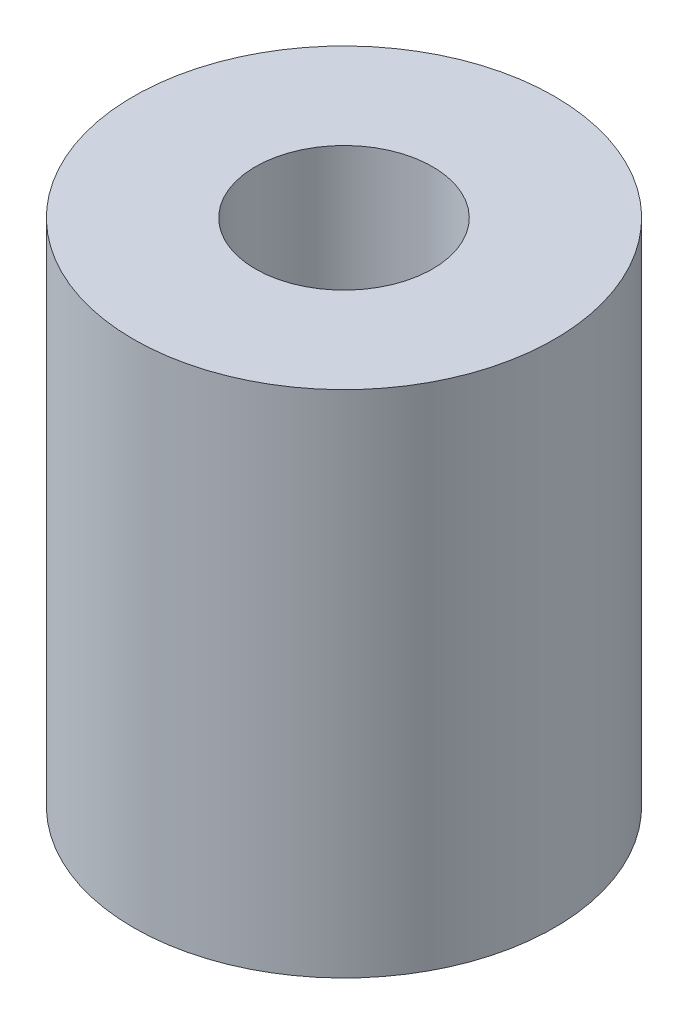
ISO-10303-21;
HEADER;
FILE_DESCRIPTION(('STEP AP214'),'2;1');
FILE_NAME('part.step','',(''),(''),'','','');
FILE_SCHEMA(('AUTOMOTIVE_DESIGN { 1 0 10303 214 1 1 1 1 }'));
ENDSEC;
DATA;
#1=APPLICATION_CONTEXT('core data for automotive mechanical design processes');
#2=APPLICATION_PROTOCOL_DEFINITION('international standard','automotive_design',2000,#1);
#3=PRODUCT_CONTEXT('',#1,'mechanical');
#4=PRODUCT('Part','Part','',(#3));
#5=PRODUCT_RELATED_PRODUCT_CATEGORY('part','',(#4));
#6=PRODUCT_DEFINITION_FORMATION('','',#4);
#7=PRODUCT_DEFINITION_CONTEXT('part definition',#1,'design');
#8=PRODUCT_DEFINITION('design','',#6,#7);
#9=PRODUCT_DEFINITION_SHAPE('','',#8);
#10=(LENGTH_UNIT() NAMED_UNIT(*) SI_UNIT(.MILLI.,.METRE.));
#11=(NAMED_UNIT(*) PLANE_ANGLE_UNIT() SI_UNIT($,.RADIAN.));
#12=(NAMED_UNIT(*) SI_UNIT($,.STERADIAN.) SOLID_ANGLE_UNIT());
#13=UNCERTAINTY_MEASURE_WITH_UNIT(LENGTH_MEASURE(1.E-05),#10,'distance_accuracy_value','');
#14=(GEOMETRIC_REPRESENTATION_CONTEXT(3) GLOBAL_UNCERTAINTY_ASSIGNED_CONTEXT((#13)) GLOBAL_UNIT_ASSIGNED_CONTEXT((#10,
#11,#12)) REPRESENTATION_CONTEXT('',''));
#15=CARTESIAN_POINT('',(0.,0.,0.));
#16=DIRECTION('',(0.,0.,1.));
#17=DIRECTION('',(1.,0.,0.));
#18=AXIS2_PLACEMENT_3D('',#15,#16,#17);
#19=CARTESIAN_POINT('',(0.,23.,0.));
#20=DIRECTION('',(0.,-1.,0.));
#21=DIRECTION('',(0.,0.,-1.));
#22=AXIS2_PLACEMENT_3D('',#19,#20,#21);
#23=CYLINDRICAL_SURFACE('',#22,2.5);
#24=CARTESIAN_POINT('',(0.,0.,0.));
#25=DIRECTION('',(0.,1.,0.));
#26=DIRECTION('',(0.,0.,1.));
#27=AXIS2_PLACEMENT_3D('',#24,#25,#26);
#28=CIRCLE('',#27,2.5);
#29=CARTESIAN_POINT('',(0.,0.,2.5));
#30=VERTEX_POINT('',#29);
#31=EDGE_CURVE('E43',#30,#30,#28,.T.);
#32=ORIENTED_EDGE('',*,*,#31,.F.);
#33=EDGE_LOOP('',(#32));
#34=FACE_BOUND('',#33,.T.);
#35=CARTESIAN_POINT('',(0.,11.,0.));
#36=DIRECTION('',(0.,1.,0.));
#37=DIRECTION('',(0.,0.,1.));
#38=AXIS2_PLACEMENT_3D('',#35,#36,#37);
#39=CIRCLE('',#38,2.5);
#40=CARTESIAN_POINT('',(0.,11.,2.5));
#41=VERTEX_POINT('',#40);
#42=EDGE_CURVE('E34',#41,#41,#39,.T.);
#43=ORIENTED_EDGE('',*,*,#42,.T.);
#44=EDGE_LOOP('',(#43));
#45=FACE_BOUND('',#44,.T.);
#46=ADVANCED_FACE('F30',(#34,#45),#23,.F.);
#47=CARTESIAN_POINT('',(0.,23.,0.));
#48=DIRECTION('',(0.,1.,0.));
#49=DIRECTION('',(0.,0.,1.));
#50=AXIS2_PLACEMENT_3D('',#47,#48,#49);
#51=PLANE('',#50);
#52=CARTESIAN_POINT('',(0.,23.,0.));
#53=DIRECTION('',(0.,1.,0.));
#54=DIRECTION('',(0.,0.,1.));
#55=AXIS2_PLACEMENT_3D('',#52,#53,#54);
#56=CIRCLE('',#55,4.);
#57=CARTESIAN_POINT('',(0.,23.,4.));
#58=VERTEX_POINT('',#57);
#59=EDGE_CURVE('E47',#58,#58,#56,.T.);
#60=ORIENTED_EDGE('',*,*,#59,.F.);
#61=EDGE_LOOP('',(#60));
#62=FACE_BOUND('',#61,.T.);
#63=CARTESIAN_POINT('',(0.,23.,0.));
#64=DIRECTION('',(0.,1.,0.));
#65=DIRECTION('',(0.,0.,1.));
#66=AXIS2_PLACEMENT_3D('',#63,#64,#65);
#67=CIRCLE('',#66,9.5);
#68=CARTESIAN_POINT('',(0.,23.,9.5));
#69=VERTEX_POINT('',#68);
#70=EDGE_CURVE('E10',#69,#69,#67,.T.);
#71=ORIENTED_EDGE('',*,*,#70,.T.);
#72=EDGE_LOOP('',(#71));
#73=FACE_BOUND('',#72,.T.);
#74=ADVANCED_FACE('F68',(#62,#73),#51,.T.);
#75=CARTESIAN_POINT('',(0.,0.,0.));
#76=DIRECTION('',(0.,1.,0.));
#77=DIRECTION('',(0.,0.,1.));
#78=AXIS2_PLACEMENT_3D('',#75,#76,#77);
#79=PLANE('',#78);
#80=CARTESIAN_POINT('',(0.,0.,0.));
#81=DIRECTION('',(0.,1.,0.));
#82=DIRECTION('',(0.,0.,1.));
#83=AXIS2_PLACEMENT_3D('',#80,#81,#82);
#84=CIRCLE('',#83,9.5);
#85=CARTESIAN_POINT('',(0.,0.,9.5));
#86=VERTEX_POINT('',#85);
#87=EDGE_CURVE('E38',#86,#86,#84,.T.);
#88=ORIENTED_EDGE('',*,*,#87,.F.);
#89=EDGE_LOOP('',(#88));
#90=FACE_BOUND('',#89,.T.);
#91=ORIENTED_EDGE('',*,*,#31,.T.);
#92=EDGE_LOOP('',(#91));
#93=FACE_BOUND('',#92,.T.);
#94=ADVANCED_FACE('F74',(#90,#93),#79,.F.);
#95=CARTESIAN_POINT('',(0.,23.,0.));
#96=DIRECTION('',(0.,-1.,0.));
#97=DIRECTION('',(0.,0.,-1.));
#98=AXIS2_PLACEMENT_3D('',#95,#96,#97);
#99=CYLINDRICAL_SURFACE('',#98,9.5);
#100=ORIENTED_EDGE('',*,*,#70,.F.);
#101=EDGE_LOOP('',(#100));
#102=FACE_BOUND('',#101,.T.);
#103=ORIENTED_EDGE('',*,*,#87,.T.);
#104=EDGE_LOOP('',(#103));
#105=FACE_BOUND('',#104,.T.);
#106=ADVANCED_FACE('F32',(#102,#105),#99,.T.);
#107=CARTESIAN_POINT('',(0.,11.,0.));
#108=DIRECTION('',(0.,1.,0.));
#109=DIRECTION('',(0.,0.,1.));
#110=AXIS2_PLACEMENT_3D('',#107,#108,#109);
#111=CYLINDRICAL_SURFACE('',#110,4.);
#112=CARTESIAN_POINT('',(0.,11.,0.));
#113=DIRECTION('',(0.,1.,0.));
#114=DIRECTION('',(0.,0.,1.));
#115=AXIS2_PLACEMENT_3D('',#112,#113,#114);
#116=CIRCLE('',#115,4.);
#117=CARTESIAN_POINT('',(0.,11.,4.));
#118=VERTEX_POINT('',#117);
#119=EDGE_CURVE('E50',#118,#118,#116,.T.);
#120=ORIENTED_EDGE('',*,*,#119,.F.);
#121=EDGE_LOOP('',(#120));
#122=FACE_BOUND('',#121,.T.);
#123=ORIENTED_EDGE('',*,*,#59,.T.);
#124=EDGE_LOOP('',(#123));
#125=FACE_BOUND('',#124,.T.);
#126=ADVANCED_FACE('F60',(#122,#125),#111,.F.);
#127=CARTESIAN_POINT('',(0.,11.,0.));
#128=DIRECTION('',(0.,1.,0.));
#129=DIRECTION('',(0.,0.,1.));
#130=AXIS2_PLACEMENT_3D('',#127,#128,#129);
#131=PLANE('',#130);
#132=ORIENTED_EDGE('',*,*,#42,.F.);
#133=EDGE_LOOP('',(#132));
#134=FACE_BOUND('',#133,.T.);
#135=ORIENTED_EDGE('',*,*,#119,.T.);
#136=EDGE_LOOP('',(#135));
#137=FACE_BOUND('',#136,.T.);
#138=ADVANCED_FACE('F58',(#134,#137),#131,.T.);
#139=CLOSED_SHELL('',(#46,#74,#94,#106,#126,#138));
#140=MANIFOLD_SOLID_BREP('B2',#139);
#141=ADVANCED_BREP_SHAPE_REPRESENTATION('',(#18,#140),#14);
#142=SHAPE_DEFINITION_REPRESENTATION(#9,#141);
ENDSEC;
END-ISO-10303-21;
